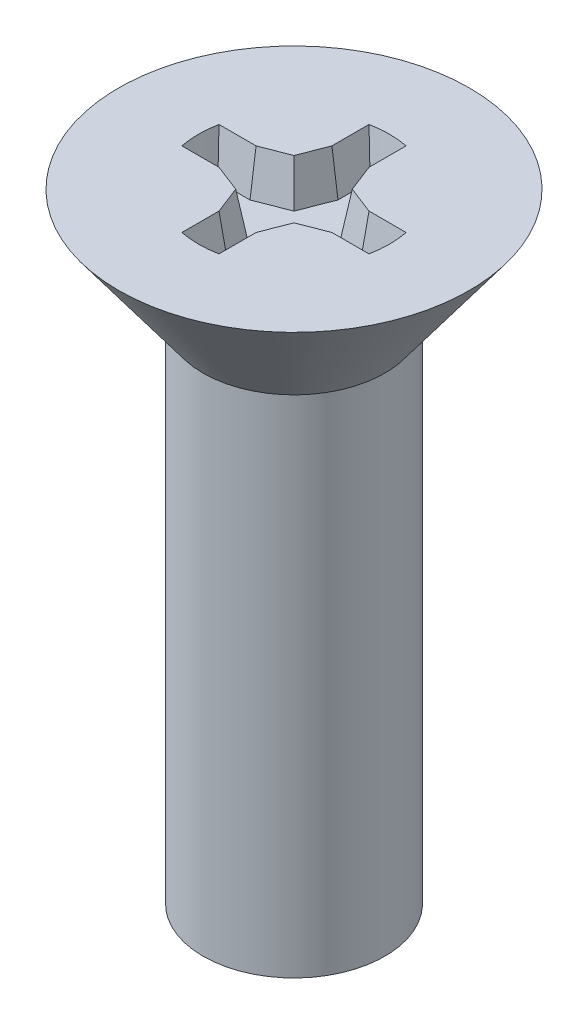
ISO-10303-21;
HEADER;
FILE_DESCRIPTION(('STEP AP214'),'2;1');
FILE_NAME('part.step','',(''),(''),'','','');
FILE_SCHEMA(('AUTOMOTIVE_DESIGN { 1 0 10303 214 1 1 1 1 }'));
ENDSEC;
DATA;
#1=APPLICATION_CONTEXT('core data for automotive mechanical design processes');
#2=APPLICATION_PROTOCOL_DEFINITION('international standard','automotive_design',2000,#1);
#3=PRODUCT_CONTEXT('',#1,'mechanical');
#4=PRODUCT('Part','Part','',(#3));
#5=PRODUCT_RELATED_PRODUCT_CATEGORY('part','',(#4));
#6=PRODUCT_DEFINITION_FORMATION('','',#4);
#7=PRODUCT_DEFINITION_CONTEXT('part definition',#1,'design');
#8=PRODUCT_DEFINITION('design','',#6,#7);
#9=PRODUCT_DEFINITION_SHAPE('','',#8);
#10=(LENGTH_UNIT() NAMED_UNIT(*) SI_UNIT(.MILLI.,.METRE.));
#11=(NAMED_UNIT(*) PLANE_ANGLE_UNIT() SI_UNIT($,.RADIAN.));
#12=(NAMED_UNIT(*) SI_UNIT($,.STERADIAN.) SOLID_ANGLE_UNIT());
#13=UNCERTAINTY_MEASURE_WITH_UNIT(LENGTH_MEASURE(1.E-05),#10,'distance_accuracy_value','');
#14=(GEOMETRIC_REPRESENTATION_CONTEXT(3) GLOBAL_UNCERTAINTY_ASSIGNED_CONTEXT((#13)) GLOBAL_UNIT_ASSIGNED_CONTEXT((#10,
#11,#12)) REPRESENTATION_CONTEXT('',''));
#15=CARTESIAN_POINT('',(0.,0.,0.));
#16=DIRECTION('',(0.,0.,1.));
#17=DIRECTION('',(1.,0.,0.));
#18=AXIS2_PLACEMENT_3D('',#15,#16,#17);
#19=CARTESIAN_POINT('',(-0.925519669670004,1.35,0.));
#20=DIRECTION('',(0.,-1.,0.));
#21=DIRECTION('',(0.,0.,-1.));
#22=AXIS2_PLACEMENT_3D('',#19,#20,#21);
#23=PLANE('',#22);
#24=DIRECTION('',(0.361616294640555,0.,0.932327011005492));
#25=VECTOR('',#24,1.);
#26=CARTESIAN_POINT('',(-0.218484474493163,1.35,1.0146341907738));
#27=LINE('',#26,#25);
#28=CARTESIAN_POINT('',(-0.440983179903434,1.35,0.440983179903433));
#29=VERTEX_POINT('',#28);
#30=CARTESIAN_POINT('',(-0.208938415433229,1.35,1.03924604826511));
#31=VERTEX_POINT('',#30);
#32=EDGE_CURVE('E124',#29,#31,#27,.T.);
#33=ORIENTED_EDGE('',*,*,#32,.T.);
#34=DIRECTION('',(0.,0.,1.));
#35=VECTOR('',#34,1.);
#36=CARTESIAN_POINT('',(-0.208938415433228,1.35,1.76564435830096));
#37=LINE('',#36,#35);
#38=CARTESIAN_POINT('',(-0.208938415433889,1.35000000000109,1.64572822932288));
#39=VERTEX_POINT('',#38);
#40=EDGE_CURVE('E127',#31,#39,#37,.T.);
#41=ORIENTED_EDGE('',*,*,#40,.T.);
#42=CARTESIAN_POINT('',(0.,1.35000000000218,0.));
#43=DIRECTION('',(0.,1.,0.));
#44=DIRECTION('',(0.,0.,1.));
#45=AXIS2_PLACEMENT_3D('',#42,#43,#44);
#46=CIRCLE('',#45,1.65893841544371);
#47=CARTESIAN_POINT('',(0.208938415433228,1.35000000000109,1.64572822931788));
#48=VERTEX_POINT('',#47);
#49=EDGE_CURVE('E170',#39,#48,#46,.T.);
#50=ORIENTED_EDGE('',*,*,#49,.T.);
#51=DIRECTION('',(0.,0.,1.));
#52=VECTOR('',#51,1.);
#53=CARTESIAN_POINT('',(0.208938415433228,1.35,1.06564435830096));
#54=LINE('',#53,#52);
#55=CARTESIAN_POINT('',(0.208938415433228,1.35,1.03924604826511));
#56=VERTEX_POINT('',#55);
#57=EDGE_CURVE('E171',#48,#56,#54,.F.);
#58=ORIENTED_EDGE('',*,*,#57,.T.);
#59=DIRECTION('',(0.361616294640553,0.,-0.932327011005493));
#60=VECTOR('',#59,1.);
#61=CARTESIAN_POINT('',(0.418484474493161,1.35,0.49898983247284));
#62=LINE('',#61,#60);
#63=CARTESIAN_POINT('',(0.440983179903431,1.35,0.440983179903435));
#64=VERTEX_POINT('',#63);
#65=EDGE_CURVE('E396',#56,#64,#62,.T.);
#66=ORIENTED_EDGE('',*,*,#65,.T.);
#67=DIRECTION('',(0.932327011005492,0.,-0.361616294640556));
#68=VECTOR('',#67,1.);
#69=CARTESIAN_POINT('',(1.0146341907738,1.35,0.218484474493163));
#70=LINE('',#69,#68);
#71=CARTESIAN_POINT('',(1.03924604826511,1.35,0.208938415433229));
#72=VERTEX_POINT('',#71);
#73=EDGE_CURVE('E213',#64,#72,#70,.T.);
#74=ORIENTED_EDGE('',*,*,#73,.T.);
#75=DIRECTION('',(1.,0.,0.));
#76=VECTOR('',#75,1.);
#77=CARTESIAN_POINT('',(1.76564435830096,1.35,0.208938415433228));
#78=LINE('',#77,#76);
#79=CARTESIAN_POINT('',(1.64572822930434,1.35000000000109,0.208938415432721));
#80=VERTEX_POINT('',#79);
#81=EDGE_CURVE('E214',#72,#80,#78,.T.);
#82=ORIENTED_EDGE('',*,*,#81,.T.);
#83=CARTESIAN_POINT('',(0.,1.35000000000218,0.));
#84=DIRECTION('',(0.,1.,0.));
#85=DIRECTION('',(0.,0.,1.));
#86=AXIS2_PLACEMENT_3D('',#83,#84,#85);
#87=CIRCLE('',#86,1.65893841542517);
#88=CARTESIAN_POINT('',(1.6457282293085,1.35000000000109,-0.20893841543342));
#89=VERTEX_POINT('',#88);
#90=EDGE_CURVE('E434',#80,#89,#87,.T.);
#91=ORIENTED_EDGE('',*,*,#90,.T.);
#92=DIRECTION('',(1.,0.,0.));
#93=VECTOR('',#92,1.);
#94=CARTESIAN_POINT('',(1.06564435830096,1.35,-0.208938415433227));
#95=LINE('',#94,#93);
#96=CARTESIAN_POINT('',(1.03924604826511,1.35,-0.208938415433228));
#97=VERTEX_POINT('',#96);
#98=EDGE_CURVE('E435',#89,#97,#95,.F.);
#99=ORIENTED_EDGE('',*,*,#98,.T.);
#100=DIRECTION('',(-0.932327011005493,0.,-0.361616294640552));
#101=VECTOR('',#100,1.);
#102=CARTESIAN_POINT('',(0.498989832472839,1.35,-0.418484474493161));
#103=LINE('',#102,#101);
#104=CARTESIAN_POINT('',(0.440983179903434,1.35,-0.440983179903431));
#105=VERTEX_POINT('',#104);
#106=EDGE_CURVE('E217',#97,#105,#103,.T.);
#107=ORIENTED_EDGE('',*,*,#106,.T.);
#108=DIRECTION('',(-0.361616294640555,0.,-0.932327011005492));
#109=VECTOR('',#108,1.);
#110=CARTESIAN_POINT('',(0.218484474493163,1.35,-1.0146341907738));
#111=LINE('',#110,#109);
#112=CARTESIAN_POINT('',(0.208938415433229,1.35,-1.03924604826511));
#113=VERTEX_POINT('',#112);
#114=EDGE_CURVE('E230',#105,#113,#111,.T.);
#115=ORIENTED_EDGE('',*,*,#114,.T.);
#116=DIRECTION('',(0.,0.,1.));
#117=VECTOR('',#116,1.);
#118=CARTESIAN_POINT('',(0.208938415433228,1.35,-1.76564435830096));
#119=LINE('',#118,#117);
#120=CARTESIAN_POINT('',(0.208938415433258,1.35000000000109,-1.64572822931286));
#121=VERTEX_POINT('',#120);
#122=EDGE_CURVE('E241',#113,#121,#119,.F.);
#123=ORIENTED_EDGE('',*,*,#122,.T.);
#124=CARTESIAN_POINT('',(0.,1.35000000000218,0.));
#125=DIRECTION('',(0.,1.,0.));
#126=DIRECTION('',(0.,0.,1.));
#127=AXIS2_PLACEMENT_3D('',#124,#125,#126);
#128=CIRCLE('',#127,1.65893841543369);
#129=CARTESIAN_POINT('',(-0.208938415433421,1.35000000000109,-1.6457282293128));
#130=VERTEX_POINT('',#129);
#131=EDGE_CURVE('E270',#121,#130,#128,.T.);
#132=ORIENTED_EDGE('',*,*,#131,.T.);
#133=DIRECTION('',(0.,0.,1.));
#134=VECTOR('',#133,1.);
#135=CARTESIAN_POINT('',(-0.208938415433228,1.35,-1.06564435830096));
#136=LINE('',#135,#134);
#137=CARTESIAN_POINT('',(-0.208938415433229,1.35,-1.03924604826511));
#138=VERTEX_POINT('',#137);
#139=EDGE_CURVE('E273',#130,#138,#136,.T.);
#140=ORIENTED_EDGE('',*,*,#139,.T.);
#141=DIRECTION('',(-0.361616294640553,0.,0.932327011005493));
#142=VECTOR('',#141,1.);
#143=CARTESIAN_POINT('',(-0.418484474493163,1.35,-0.498989832472838));
#144=LINE('',#143,#142);
#145=CARTESIAN_POINT('',(-0.440983179903433,1.35,-0.440983179903434));
#146=VERTEX_POINT('',#145);
#147=EDGE_CURVE('E242',#138,#146,#144,.T.);
#148=ORIENTED_EDGE('',*,*,#147,.T.);
#149=DIRECTION('',(-0.932327011005492,0.,0.361616294640555));
#150=VECTOR('',#149,1.);
#151=CARTESIAN_POINT('',(-1.0146341907738,1.35,-0.218484474493162));
#152=LINE('',#151,#150);
#153=CARTESIAN_POINT('',(-1.03924604826511,1.35,-0.208938415433228));
#154=VERTEX_POINT('',#153);
#155=EDGE_CURVE('E314',#146,#154,#152,.T.);
#156=ORIENTED_EDGE('',*,*,#155,.T.);
#157=DIRECTION('',(1.,0.,0.));
#158=VECTOR('',#157,1.);
#159=CARTESIAN_POINT('',(-1.76564435830096,1.35,-0.208938415433227));
#160=LINE('',#159,#158);
#161=CARTESIAN_POINT('',(-1.64572822930364,1.35000000000109,-0.208938415432676));
#162=VERTEX_POINT('',#161);
#163=EDGE_CURVE('E108',#154,#162,#160,.F.);
#164=ORIENTED_EDGE('',*,*,#163,.T.);
#165=CARTESIAN_POINT('',(0.,1.35000000000218,0.));
#166=DIRECTION('',(0.,1.,0.));
#167=DIRECTION('',(0.,0.,1.));
#168=AXIS2_PLACEMENT_3D('',#165,#166,#167);
#169=CIRCLE('',#168,1.65893841542447);
#170=CARTESIAN_POINT('',(-1.64572822930815,1.35000000000109,0.208938415433421));
#171=VERTEX_POINT('',#170);
#172=EDGE_CURVE('E28',#162,#171,#169,.T.);
#173=ORIENTED_EDGE('',*,*,#172,.T.);
#174=DIRECTION('',(1.,0.,0.));
#175=VECTOR('',#174,1.);
#176=CARTESIAN_POINT('',(-1.06564435830096,1.35,0.208938415433228));
#177=LINE('',#176,#175);
#178=CARTESIAN_POINT('',(-1.03924604826511,1.35,0.208938415433229));
#179=VERTEX_POINT('',#178);
#180=EDGE_CURVE('E117',#171,#179,#177,.T.);
#181=ORIENTED_EDGE('',*,*,#180,.T.);
#182=DIRECTION('',(0.932327011005493,0.,0.361616294640553));
#183=VECTOR('',#182,1.);
#184=CARTESIAN_POINT('',(-0.498989832472839,1.35,0.418484474493163));
#185=LINE('',#184,#183);
#186=EDGE_CURVE('E128',#179,#29,#185,.T.);
#187=ORIENTED_EDGE('',*,*,#186,.T.);
#188=EDGE_LOOP('',(#33,#41,#50,#58,#66,#74,#82,#91,#99,#107,#115,#123,#132,#140,#148,#156,#164,
#173,#181,#187));
#189=FACE_BOUND('',#188,.T.);
#190=ADVANCED_FACE('F25',(#189),#23,.F.);
#191=CARTESIAN_POINT('',(-0.35,2.15,1.06564435830096));
#192=DIRECTION('',(-0.918162868780907,-0.17364817766693,0.356122530577566));
#193=DIRECTION('',(0.361616294640555,0.,0.932327011005492));
#194=AXIS2_PLACEMENT_3D('',#191,#192,#193);
#195=PLANE('',#194);
#196=DIRECTION('',(0.173556561603969,-0.98428817249995,-0.0324794304278424));
#197=VECTOR('',#196,1.);
#198=CARTESIAN_POINT('',(-0.35,2.15,1.06564435830096));
#199=LINE('',#198,#197);
#200=CARTESIAN_POINT('',(-0.35,2.15,1.06564435830096));
#201=VERTEX_POINT('',#200);
#202=EDGE_CURVE('E136',#201,#31,#199,.T.);
#203=ORIENTED_EDGE('',*,*,#202,.T.);
#204=ORIENTED_EDGE('',*,*,#32,.F.);
#205=DIRECTION('',(-0.133808874519465,0.98193195802951,0.133808874519467));
#206=VECTOR('',#205,1.);
#207=CARTESIAN_POINT('',(-0.440983179903434,1.35,0.440983179903433));
#208=LINE('',#207,#206);
#209=CARTESIAN_POINT('',(-0.55,2.15,0.55));
#210=VERTEX_POINT('',#209);
#211=EDGE_CURVE('E557',#29,#210,#208,.T.);
#212=ORIENTED_EDGE('',*,*,#211,.T.);
#213=DIRECTION('',(-0.361616294640553,0.,-0.932327011005493));
#214=VECTOR('',#213,1.);
#215=CARTESIAN_POINT('',(-0.35,2.15,1.06564435830096));
#216=LINE('',#215,#214);
#217=EDGE_CURVE('E139',#201,#210,#216,.T.);
#218=ORIENTED_EDGE('',*,*,#217,.F.);
#219=EDGE_LOOP('',(#203,#204,#212,#218));
#220=FACE_BOUND('',#219,.T.);
#221=ADVANCED_FACE('F137',(#220),#195,.F.);
#222=CARTESIAN_POINT('',(-0.55,2.15,0.55));
#223=DIRECTION('',(-0.356122530577564,-0.173648177666931,0.918162868780908));
#224=DIRECTION('',(0.932327011005493,0.,0.361616294640553));
#225=AXIS2_PLACEMENT_3D('',#222,#223,#224);
#226=PLANE('',#225);
#227=ORIENTED_EDGE('',*,*,#211,.F.);
#228=ORIENTED_EDGE('',*,*,#186,.F.);
#229=DIRECTION('',(-0.0324794304278424,0.98428817249995,0.17355656160397));
#230=VECTOR('',#229,1.);
#231=CARTESIAN_POINT('',(-1.03924604826511,1.35,0.208938415433228));
#232=LINE('',#231,#230);
#233=CARTESIAN_POINT('',(-1.06564435830096,2.15,0.350000000000001));
#234=VERTEX_POINT('',#233);
#235=EDGE_CURVE('E643',#179,#234,#232,.T.);
#236=ORIENTED_EDGE('',*,*,#235,.T.);
#237=DIRECTION('',(-0.932327011005494,0.,-0.361616294640551));
#238=VECTOR('',#237,1.);
#239=CARTESIAN_POINT('',(-0.55,2.15,0.55));
#240=LINE('',#239,#238);
#241=EDGE_CURVE('E163',#210,#234,#240,.T.);
#242=ORIENTED_EDGE('',*,*,#241,.F.);
#243=EDGE_LOOP('',(#227,#228,#236,#242));
#244=FACE_BOUND('',#243,.T.);
#245=ADVANCED_FACE('F339',(#244),#226,.F.);
#246=CARTESIAN_POINT('',(-1.06564435830096,2.15,0.350000000000001));
#247=DIRECTION('',(0.,-0.173648177666931,0.984807753012208));
#248=DIRECTION('',(0.,-0.984807753012208,-0.173648177666931));
#249=AXIS2_PLACEMENT_3D('',#246,#247,#248);
#250=PLANE('',#249);
#251=ORIENTED_EDGE('',*,*,#235,.F.);
#252=ORIENTED_EDGE('',*,*,#180,.F.);
#253=CARTESIAN_POINT('',(-1.76564435830096,2.15,0.350000000000001));
#254=CARTESIAN_POINT('',(-1.7056862937075,1.73593925162568,0.276989918409269));
#255=CARTESIAN_POINT('',(-1.64572822931259,1.35,0.208938415433228));
#256=B_SPLINE_CURVE_WITH_KNOTS('',2,(#253,#254,#255),.UNSPECIFIED.,.F.,.F.,(3,3),(0.,1.),.UNSPECIFIED.);
#257=CARTESIAN_POINT('',(-1.76564435830135,2.15000000001437,0.350000000000001));
#258=VERTEX_POINT('',#257);
#259=EDGE_CURVE('E320',#171,#258,#256,.F.);
#260=ORIENTED_EDGE('',*,*,#259,.T.);
#261=DIRECTION('',(1.,0.,0.));
#262=VECTOR('',#261,1.);
#263=CARTESIAN_POINT('',(0.,2.15,0.350000000000001));
#264=LINE('',#263,#262);
#265=EDGE_CURVE('E509',#234,#258,#264,.F.);
#266=ORIENTED_EDGE('',*,*,#265,.F.);
#267=EDGE_LOOP('',(#251,#252,#260,#266));
#268=FACE_BOUND('',#267,.T.);
#269=ADVANCED_FACE('F328',(#268),#250,.F.);
#270=CARTESIAN_POINT('',(0.,2.14999999985821,0.));
#271=DIRECTION('',(0.,1.,0.));
#272=DIRECTION('',(0.,0.,1.));
#273=AXIS2_PLACEMENT_3D('',#270,#271,#272);
#274=CONICAL_SURFACE('',#273,1.79999999997071,0.174532925205307);
#275=ORIENTED_EDGE('',*,*,#259,.F.);
#276=ORIENTED_EDGE('',*,*,#172,.F.);
#277=CARTESIAN_POINT('',(-1.6457282293038,1.35000000000156,-0.208938415432112));
#278=CARTESIAN_POINT('',(-1.65070934139582,1.3820625774919,-0.214591907998902));
#279=CARTESIAN_POINT('',(-1.65566838188282,1.41412848763102,-0.220245937330613));
#280=CARTESIAN_POINT('',(-1.66559816802352,1.47862236928866,-0.231617794663121));
#281=CARTESIAN_POINT('',(-1.6705684336483,1.51105041256893,-0.237335634852783));
#282=CARTESIAN_POINT('',(-1.6805203681666,1.57626855896286,-0.248835174664004));
#283=CARTESIAN_POINT('',(-1.68550156418484,1.60905873201504,-0.254616886832574));
#284=CARTESIAN_POINT('',(-1.69547505663126,1.67500114064804,-0.266244202269753));
#285=CARTESIAN_POINT('',(-1.70046688710381,1.70815344447968,-0.27208981812157));
#286=CARTESIAN_POINT('',(-1.71046136137333,1.77482011604494,-0.283844952154033));
#287=CARTESIAN_POINT('',(-1.71546354608948,1.8083345504105,-0.289754482738613));
#288=CARTESIAN_POINT('',(-1.72547845290019,1.87572548488629,-0.301637434665236));
#289=CARTESIAN_POINT('',(-1.73049072269614,1.90960205009352,-0.307610868000329));
#290=CARTESIAN_POINT('',(-1.74052554004884,1.97771724705958,-0.319621593283294));
#291=CARTESIAN_POINT('',(-1.74554764205458,2.01195594244403,-0.325658896614664));
#292=CARTESIAN_POINT('',(-1.75560186777891,2.08079540382918,-0.337797304175388));
#293=CARTESIAN_POINT('',(-1.76063355252783,2.11539623208874,-0.343898418936132));
#294=CARTESIAN_POINT('',(-1.76564435829687,2.15000000000073,-0.34999999999919));
#295=B_SPLINE_CURVE_WITH_KNOTS('',3,(#277,#278,#279,#280,#281,#282,#283,#284,#285,#286,#287,
#288,#289,#290,#291,#292,#293,#294),.UNSPECIFIED.,.F.,.F.,(4,2,2,2,2,2,2,2,4),(0.,
0.0988080918933877,0.198711901448957,0.299711495062222,0.401806930357422,0.504998256525959,
0.609285514650121,0.714668738013174,0.821147952396807),.UNSPECIFIED.);
#296=CARTESIAN_POINT('',(-1.76564435829931,2.15000000001474,-0.349999999999594));
#297=VERTEX_POINT('',#296);
#298=EDGE_CURVE('E319',#162,#297,#295,.T.);
#299=ORIENTED_EDGE('',*,*,#298,.T.);
#300=CARTESIAN_POINT('',(0.,2.15000000002874,0.));
#301=DIRECTION('',(0.,1.,0.));
#302=DIRECTION('',(0.,0.,1.));
#303=AXIS2_PLACEMENT_3D('',#300,#301,#302);
#304=CIRCLE('',#303,1.80000000000077);
#305=EDGE_CURVE('E505',#258,#297,#304,.F.);
#306=ORIENTED_EDGE('',*,*,#305,.F.);
#307=EDGE_LOOP('',(#275,#276,#299,#306));
#308=FACE_BOUND('',#307,.T.);
#309=ADVANCED_FACE('F338',(#308),#274,.F.);
#310=CARTESIAN_POINT('',(-1.76564435830096,2.15,-0.349999999999999));
#311=DIRECTION('',(0.,-0.17364817766693,-0.984807753012208));
#312=DIRECTION('',(0.,0.984807753012208,-0.17364817766693));
#313=AXIS2_PLACEMENT_3D('',#310,#311,#312);
#314=PLANE('',#313);
#315=ORIENTED_EDGE('',*,*,#298,.F.);
#316=ORIENTED_EDGE('',*,*,#163,.F.);
#317=DIRECTION('',(-0.0324794304278416,0.98428817249995,-0.173556561603967));
#318=VECTOR('',#317,1.);
#319=CARTESIAN_POINT('',(-1.03924604826511,1.35,-0.208938415433229));
#320=LINE('',#319,#318);
#321=CARTESIAN_POINT('',(-1.06564435830096,2.15,-0.349999999999999));
#322=VERTEX_POINT('',#321);
#323=EDGE_CURVE('E310',#154,#322,#320,.T.);
#324=ORIENTED_EDGE('',*,*,#323,.T.);
#325=DIRECTION('',(1.,0.,0.));
#326=VECTOR('',#325,1.);
#327=CARTESIAN_POINT('',(0.,2.15,-0.349999999999999));
#328=LINE('',#327,#326);
#329=EDGE_CURVE('E307',#297,#322,#328,.T.);
#330=ORIENTED_EDGE('',*,*,#329,.F.);
#331=EDGE_LOOP('',(#315,#316,#324,#330));
#332=FACE_BOUND('',#331,.T.);
#333=ADVANCED_FACE('F689',(#332),#314,.F.);
#334=CARTESIAN_POINT('',(-1.06564435830096,2.15,-0.349999999999999));
#335=DIRECTION('',(-0.356122530577566,-0.17364817766693,-0.918162868780907));
#336=DIRECTION('',(-0.932327011005492,0.,0.361616294640555));
#337=AXIS2_PLACEMENT_3D('',#334,#335,#336);
#338=PLANE('',#337);
#339=ORIENTED_EDGE('',*,*,#323,.F.);
#340=ORIENTED_EDGE('',*,*,#155,.F.);
#341=DIRECTION('',(-0.133808874519466,0.98193195802951,-0.133808874519465));
#342=VECTOR('',#341,1.);
#343=CARTESIAN_POINT('',(-0.440983179903433,1.35,-0.440983179903434));
#344=LINE('',#343,#342);
#345=CARTESIAN_POINT('',(-0.55,2.15,-0.55));
#346=VERTEX_POINT('',#345);
#347=EDGE_CURVE('E283',#146,#346,#344,.T.);
#348=ORIENTED_EDGE('',*,*,#347,.T.);
#349=DIRECTION('',(0.932327011005493,0.,-0.361616294640554));
#350=VECTOR('',#349,1.);
#351=CARTESIAN_POINT('',(-1.06564435830096,2.15,-0.349999999999999));
#352=LINE('',#351,#350);
#353=EDGE_CURVE('E296',#322,#346,#352,.T.);
#354=ORIENTED_EDGE('',*,*,#353,.F.);
#355=EDGE_LOOP('',(#339,#340,#348,#354));
#356=FACE_BOUND('',#355,.T.);
#357=ADVANCED_FACE('F632',(#356),#338,.F.);
#358=CARTESIAN_POINT('',(-0.55,2.15,-0.549999999999999));
#359=DIRECTION('',(-0.918162868780908,-0.17364817766693,-0.356122530577564));
#360=DIRECTION('',(-0.361616294640553,0.,0.932327011005493));
#361=AXIS2_PLACEMENT_3D('',#358,#359,#360);
#362=PLANE('',#361);
#363=ORIENTED_EDGE('',*,*,#347,.F.);
#364=ORIENTED_EDGE('',*,*,#147,.F.);
#365=DIRECTION('',(-0.173556561603969,0.98428817249995,-0.0324794304278424));
#366=VECTOR('',#365,1.);
#367=CARTESIAN_POINT('',(-0.208938415433228,1.35,-1.03924604826511));
#368=LINE('',#367,#366);
#369=CARTESIAN_POINT('',(-0.35,2.15,-1.06564435830096));
#370=VERTEX_POINT('',#369);
#371=EDGE_CURVE('E282',#138,#370,#368,.T.);
#372=ORIENTED_EDGE('',*,*,#371,.T.);
#373=DIRECTION('',(0.361616294640553,0.,-0.932327011005493));
#374=VECTOR('',#373,1.);
#375=CARTESIAN_POINT('',(-0.55,2.15,-0.55));
#376=LINE('',#375,#374);
#377=EDGE_CURVE('E291',#346,#370,#376,.T.);
#378=ORIENTED_EDGE('',*,*,#377,.F.);
#379=EDGE_LOOP('',(#363,#364,#372,#378));
#380=FACE_BOUND('',#379,.T.);
#381=ADVANCED_FACE('F261',(#380),#362,.F.);
#382=CARTESIAN_POINT('',(-0.35,2.15,-1.06564435830096));
#383=DIRECTION('',(-0.984807753012208,-0.17364817766693,0.));
#384=DIRECTION('',(0.17364817766693,-0.984807753012208,0.));
#385=AXIS2_PLACEMENT_3D('',#382,#383,#384);
#386=PLANE('',#385);
#387=ORIENTED_EDGE('',*,*,#371,.F.);
#388=ORIENTED_EDGE('',*,*,#139,.F.);
#389=CARTESIAN_POINT('',(-0.35,2.15,-1.76564435830096));
#390=CARTESIAN_POINT('',(-0.276989918408215,1.7359392516197,-1.7056862938678));
#391=CARTESIAN_POINT('',(-0.208938415433228,1.35,-1.64572822931259));
#392=B_SPLINE_CURVE_WITH_KNOTS('',2,(#389,#390,#391),.UNSPECIFIED.,.F.,.F.,(3,3),(0.,1.),.UNSPECIFIED.);
#393=CARTESIAN_POINT('',(-0.35,2.15000000001437,-1.76564435830094));
#394=VERTEX_POINT('',#393);
#395=EDGE_CURVE('E265',#130,#394,#392,.F.);
#396=ORIENTED_EDGE('',*,*,#395,.T.);
#397=DIRECTION('',(0.,0.,1.));
#398=VECTOR('',#397,1.);
#399=CARTESIAN_POINT('',(-0.35,2.15,-3.31));
#400=LINE('',#399,#398);
#401=EDGE_CURVE('E295',#370,#394,#400,.F.);
#402=ORIENTED_EDGE('',*,*,#401,.F.);
#403=EDGE_LOOP('',(#387,#388,#396,#402));
#404=FACE_BOUND('',#403,.T.);
#405=ADVANCED_FACE('F255',(#404),#386,.F.);
#406=CARTESIAN_POINT('',(0.,2.15000000002874,0.));
#407=DIRECTION('',(0.,1.,0.));
#408=DIRECTION('',(0.,0.,1.));
#409=AXIS2_PLACEMENT_3D('',#406,#407,#408);
#410=CONICAL_SURFACE('',#409,1.79999999999997,0.174532925193156);
#411=ORIENTED_EDGE('',*,*,#395,.F.);
#412=ORIENTED_EDGE('',*,*,#131,.F.);
#413=CARTESIAN_POINT('',(0.208938415433238,1.34999999999999,-1.64572822931266));
#414=CARTESIAN_POINT('',(0.214591908006114,1.38206257751534,-1.65070934140795));
#415=CARTESIAN_POINT('',(0.220245937343788,1.41412848767949,-1.65566838189819));
#416=CARTESIAN_POINT('',(0.231617794686658,1.47862236938007,-1.66559816804421));
#417=CARTESIAN_POINT('',(0.237335634880716,1.51105041267825,-1.67056843367108));
#418=CARTESIAN_POINT('',(0.24883517469909,1.57626855910085,-1.68052036819246));
#419=CARTESIAN_POINT('',(0.254616886870412,1.6090587321638,-1.68550156421169));
#420=CARTESIAN_POINT('',(0.266244202311385,1.67500114081121,-1.69547505665906));
#421=CARTESIAN_POINT('',(0.272089818164238,1.70815344464649,-1.70046688713156));
#422=CARTESIAN_POINT('',(0.28384495219699,1.77482011621188,-1.71046136139999));
#423=CARTESIAN_POINT('',(0.289754482780817,1.80833455057395,-1.7154635461151));
#424=CARTESIAN_POINT('',(0.301637434704071,1.87572548503562,-1.72547845292279));
#425=CARTESIAN_POINT('',(0.307610868036542,1.90960205023222,-1.73049072271678));
#426=CARTESIAN_POINT('',(0.319621593312339,1.97771724716988,-1.74052554006464));
#427=CARTESIAN_POINT('',(0.325658896639152,2.01195594253657,-1.74554764206753));
#428=CARTESIAN_POINT('',(0.337797304188762,2.08079540387906,-1.75560186778533));
#429=CARTESIAN_POINT('',(0.343898418942938,2.11539623211373,-1.76063355253059));
#430=CARTESIAN_POINT('',(0.349999999999037,2.15000000000087,-1.7656443582961));
#431=B_SPLINE_CURVE_WITH_KNOTS('',3,(#413,#414,#415,#416,#417,#418,#419,#420,#421,#422,#423,
#424,#425,#426,#427,#428,#429,#430),.UNSPECIFIED.,.F.,.F.,(4,2,2,2,2,2,2,2,4),(0.,
0.0988080919710462,0.198711901582118,0.299711495228713,0.401806930535056,0.504998256692533,
0.609285514783416,0.714668738090959,0.821147952396834),.UNSPECIFIED.);
#432=CARTESIAN_POINT('',(0.349999999999519,2.15000000001481,-1.76564435829851));
#433=VERTEX_POINT('',#432);
#434=EDGE_CURVE('E234',#121,#433,#431,.T.);
#435=ORIENTED_EDGE('',*,*,#434,.T.);
#436=CARTESIAN_POINT('',(0.,2.15000000002874,0.));
#437=DIRECTION('',(0.,1.,0.));
#438=DIRECTION('',(0.,0.,1.));
#439=AXIS2_PLACEMENT_3D('',#436,#437,#438);
#440=CIRCLE('',#439,1.79999999999997);
#441=EDGE_CURVE('E492',#394,#433,#440,.F.);
#442=ORIENTED_EDGE('',*,*,#441,.F.);
#443=EDGE_LOOP('',(#411,#412,#435,#442));
#444=FACE_BOUND('',#443,.T.);
#445=ADVANCED_FACE('F244',(#444),#410,.F.);
#446=CARTESIAN_POINT('',(0.35,2.15,-1.76564435830096));
#447=DIRECTION('',(0.984807753012208,-0.17364817766693,0.));
#448=DIRECTION('',(0.17364817766693,0.984807753012208,0.));
#449=AXIS2_PLACEMENT_3D('',#446,#447,#448);
#450=PLANE('',#449);
#451=ORIENTED_EDGE('',*,*,#434,.F.);
#452=ORIENTED_EDGE('',*,*,#122,.F.);
#453=DIRECTION('',(0.173556561603967,0.98428817249995,-0.0324794304278416));
#454=VECTOR('',#453,1.);
#455=CARTESIAN_POINT('',(0.20893841543323,1.35,-1.03924604826511));
#456=LINE('',#455,#454);
#457=CARTESIAN_POINT('',(0.35,2.15,-1.06564435830096));
#458=VERTEX_POINT('',#457);
#459=EDGE_CURVE('E227',#113,#458,#456,.T.);
#460=ORIENTED_EDGE('',*,*,#459,.T.);
#461=DIRECTION('',(0.,0.,1.));
#462=VECTOR('',#461,1.);
#463=CARTESIAN_POINT('',(0.35,2.15,-3.31));
#464=LINE('',#463,#462);
#465=EDGE_CURVE('E467',#433,#458,#464,.T.);
#466=ORIENTED_EDGE('',*,*,#465,.F.);
#467=EDGE_LOOP('',(#451,#452,#460,#466));
#468=FACE_BOUND('',#467,.T.);
#469=ADVANCED_FACE('F254',(#468),#450,.F.);
#470=CARTESIAN_POINT('',(0.35,2.15,-1.06564435830096));
#471=DIRECTION('',(0.918162868780907,-0.17364817766693,-0.356122530577566));
#472=DIRECTION('',(-0.361616294640555,0.,-0.932327011005492));
#473=AXIS2_PLACEMENT_3D('',#470,#471,#472);
#474=PLANE('',#473);
#475=ORIENTED_EDGE('',*,*,#459,.F.);
#476=ORIENTED_EDGE('',*,*,#114,.F.);
#477=DIRECTION('',(0.133808874519466,0.98193195802951,-0.133808874519466));
#478=VECTOR('',#477,1.);
#479=CARTESIAN_POINT('',(0.440983179903434,1.35,-0.440983179903431));
#480=LINE('',#479,#478);
#481=CARTESIAN_POINT('',(0.550000000000001,2.15,-0.549999999999998));
#482=VERTEX_POINT('',#481);
#483=EDGE_CURVE('E226',#105,#482,#480,.T.);
#484=ORIENTED_EDGE('',*,*,#483,.T.);
#485=DIRECTION('',(0.361616294640554,0.,0.932327011005493));
#486=VECTOR('',#485,1.);
#487=CARTESIAN_POINT('',(0.35,2.15,-1.06564435830096));
#488=LINE('',#487,#486);
#489=EDGE_CURVE('E457',#458,#482,#488,.T.);
#490=ORIENTED_EDGE('',*,*,#489,.F.);
#491=EDGE_LOOP('',(#475,#476,#484,#490));
#492=FACE_BOUND('',#491,.T.);
#493=ADVANCED_FACE('F660',(#492),#474,.F.);
#494=CARTESIAN_POINT('',(0.55,2.15,-0.549999999999998));
#495=DIRECTION('',(0.356122530577563,-0.17364817766693,-0.918162868780908));
#496=DIRECTION('',(-0.932327011005493,0.,-0.361616294640552));
#497=AXIS2_PLACEMENT_3D('',#494,#495,#496);
#498=PLANE('',#497);
#499=ORIENTED_EDGE('',*,*,#483,.F.);
#500=ORIENTED_EDGE('',*,*,#106,.F.);
#501=DIRECTION('',(0.0324794304278424,0.98428817249995,-0.173556561603969));
#502=VECTOR('',#501,1.);
#503=CARTESIAN_POINT('',(1.03924604826511,1.35,-0.208938415433227));
#504=LINE('',#503,#502);
#505=CARTESIAN_POINT('',(1.06564435830096,2.15,-0.349999999999999));
#506=VERTEX_POINT('',#505);
#507=EDGE_CURVE('E444',#97,#506,#504,.T.);
#508=ORIENTED_EDGE('',*,*,#507,.T.);
#509=DIRECTION('',(0.932327011005493,0.,0.361616294640553));
#510=VECTOR('',#509,1.);
#511=CARTESIAN_POINT('',(0.550000000000001,2.15,-0.549999999999999));
#512=LINE('',#511,#510);
#513=EDGE_CURVE('E452',#482,#506,#512,.T.);
#514=ORIENTED_EDGE('',*,*,#513,.F.);
#515=EDGE_LOOP('',(#499,#500,#508,#514));
#516=FACE_BOUND('',#515,.T.);
#517=ADVANCED_FACE('F661',(#516),#498,.F.);
#518=CARTESIAN_POINT('',(1.06564435830096,2.15,-0.349999999999999));
#519=DIRECTION('',(0.,-0.17364817766693,-0.984807753012208));
#520=DIRECTION('',(0.,0.984807753012208,-0.17364817766693));
#521=AXIS2_PLACEMENT_3D('',#518,#519,#520);
#522=PLANE('',#521);
#523=ORIENTED_EDGE('',*,*,#507,.F.);
#524=ORIENTED_EDGE('',*,*,#98,.F.);
#525=CARTESIAN_POINT('',(1.76564435830096,2.15,-0.349999999999999));
#526=CARTESIAN_POINT('',(1.70568629361076,1.73593925162664,-0.276989918409438));
#527=CARTESIAN_POINT('',(1.64572822931259,1.35,-0.208938415433227));
#528=B_SPLINE_CURVE_WITH_KNOTS('',2,(#525,#526,#527),.UNSPECIFIED.,.F.,.F.,(3,3),(0.,1.),.UNSPECIFIED.);
#529=CARTESIAN_POINT('',(1.76564435830405,2.15000000001437,-0.349999999999999));
#530=VERTEX_POINT('',#529);
#531=EDGE_CURVE('E428',#89,#530,#528,.F.);
#532=ORIENTED_EDGE('',*,*,#531,.T.);
#533=DIRECTION('',(1.,0.,0.));
#534=VECTOR('',#533,1.);
#535=CARTESIAN_POINT('',(0.,2.15,-0.349999999999999));
#536=LINE('',#535,#534);
#537=EDGE_CURVE('E456',#506,#530,#536,.T.);
#538=ORIENTED_EDGE('',*,*,#537,.F.);
#539=EDGE_LOOP('',(#523,#524,#532,#538));
#540=FACE_BOUND('',#539,.T.);
#541=ADVANCED_FACE('F203',(#540),#522,.F.);
#542=CARTESIAN_POINT('',(0.,2.14999999991505,0.));
#543=DIRECTION('',(0.,1.,0.));
#544=DIRECTION('',(0.,0.,1.));
#545=AXIS2_PLACEMENT_3D('',#542,#543,#544);
#546=CONICAL_SURFACE('',#545,1.79999999998603,0.174532925210893);
#547=ORIENTED_EDGE('',*,*,#531,.F.);
#548=ORIENTED_EDGE('',*,*,#90,.F.);
#549=CARTESIAN_POINT('',(1.64572822930447,1.35000000000144,0.208938415432197));
#550=CARTESIAN_POINT('',(1.65070934140136,1.38206257752389,0.214591908006963));
#551=CARTESIAN_POINT('',(1.6556683818932,1.41412848769513,0.220245937346487));
#552=CARTESIAN_POINT('',(1.66559816804211,1.47862236940785,0.231617794692599));
#553=CARTESIAN_POINT('',(1.67056843367025,1.51105041271107,0.237335634888049));
#554=CARTESIAN_POINT('',(1.68052036819388,1.57626855914169,0.24883517470873));
#555=CARTESIAN_POINT('',(1.68550156421409,1.60905873220762,0.254616886880965));
#556=CARTESIAN_POINT('',(1.6954750566631,1.67500114085894,0.266244202323264));
#557=CARTESIAN_POINT('',(1.70046688713628,1.70815344469515,0.272089818176527));
#558=CARTESIAN_POINT('',(1.71046136140579,1.77482011626033,0.283844952209579));
#559=CARTESIAN_POINT('',(1.71546354612131,1.80833455062127,0.289754482793293));
#560=CARTESIAN_POINT('',(1.72547845292955,1.87572548507861,0.301637434715778));
#561=CARTESIAN_POINT('',(1.73049072272368,1.90960205027201,0.30761086804759));
#562=CARTESIAN_POINT('',(1.74052554007158,1.97771724720124,0.319621593321503));
#563=CARTESIAN_POINT('',(1.74554764207437,2.01195594256268,0.32565889664709));
#564=CARTESIAN_POINT('',(1.75560186779175,2.08079540389262,0.33779730419366));
#565=CARTESIAN_POINT('',(1.76063355253668,2.11539623211997,0.343898418946022));
#566=CARTESIAN_POINT('',(1.76564435830191,2.14999999999983,0.35000000000019));
#567=B_SPLINE_CURVE_WITH_KNOTS('',3,(#549,#550,#551,#552,#553,#554,#555,#556,#557,#558,#559,
#560,#561,#562,#563,#564,#565,#566),.UNSPECIFIED.,.F.,.F.,(4,2,2,2,2,2,2,2,4),(0.,
0.0988080919934527,0.198711901620538,0.299711495276748,0.401806930586304,0.504998256740585,
0.609285514821861,0.714668738113382,0.821147952396814),.UNSPECIFIED.);
#568=CARTESIAN_POINT('',(1.76564435830453,2.15000000001428,0.350000000000095));
#569=VERTEX_POINT('',#568);
#570=EDGE_CURVE('E208',#80,#569,#567,.T.);
#571=ORIENTED_EDGE('',*,*,#570,.T.);
#572=CARTESIAN_POINT('',(0.,2.15000000002874,0.));
#573=DIRECTION('',(0.,1.,0.));
#574=DIRECTION('',(0.,0.,1.));
#575=AXIS2_PLACEMENT_3D('',#572,#573,#574);
#576=CIRCLE('',#575,1.80000000000607);
#577=EDGE_CURVE('E503',#530,#569,#576,.F.);
#578=ORIENTED_EDGE('',*,*,#577,.F.);
#579=EDGE_LOOP('',(#547,#548,#571,#578));
#580=FACE_BOUND('',#579,.T.);
#581=ADVANCED_FACE('F198',(#580),#546,.F.);
#582=CARTESIAN_POINT('',(1.76564435830096,2.15,0.350000000000001));
#583=DIRECTION('',(0.,-0.173648177666931,0.984807753012208));
#584=DIRECTION('',(0.,-0.984807753012208,-0.173648177666931));
#585=AXIS2_PLACEMENT_3D('',#582,#583,#584);
#586=PLANE('',#585);
#587=ORIENTED_EDGE('',*,*,#570,.F.);
#588=ORIENTED_EDGE('',*,*,#81,.F.);
#589=DIRECTION('',(0.0324794304278416,0.98428817249995,0.173556561603968));
#590=VECTOR('',#589,1.);
#591=CARTESIAN_POINT('',(1.03924604826511,1.35,0.20893841543323));
#592=LINE('',#591,#590);
#593=CARTESIAN_POINT('',(1.06564435830096,2.15,0.350000000000001));
#594=VERTEX_POINT('',#593);
#595=EDGE_CURVE('E405',#72,#594,#592,.T.);
#596=ORIENTED_EDGE('',*,*,#595,.T.);
#597=DIRECTION('',(1.,0.,0.));
#598=VECTOR('',#597,1.);
#599=CARTESIAN_POINT('',(0.,2.15,0.350000000000001));
#600=LINE('',#599,#598);
#601=EDGE_CURVE('E418',#569,#594,#600,.F.);
#602=ORIENTED_EDGE('',*,*,#601,.F.);
#603=EDGE_LOOP('',(#587,#588,#596,#602));
#604=FACE_BOUND('',#603,.T.);
#605=ADVANCED_FACE('F194',(#604),#586,.F.);
#606=CARTESIAN_POINT('',(1.06564435830096,2.15,0.350000000000001));
#607=DIRECTION('',(0.356122530577566,-0.173648177666931,0.918162868780907));
#608=DIRECTION('',(0.932327011005492,0.,-0.361616294640556));
#609=AXIS2_PLACEMENT_3D('',#606,#607,#608);
#610=PLANE('',#609);
#611=ORIENTED_EDGE('',*,*,#595,.F.);
#612=ORIENTED_EDGE('',*,*,#73,.F.);
#613=DIRECTION('',(0.133808874519467,0.98193195802951,0.133808874519465));
#614=VECTOR('',#613,1.);
#615=CARTESIAN_POINT('',(0.440983179903431,1.35,0.440983179903435));
#616=LINE('',#615,#614);
#617=CARTESIAN_POINT('',(0.55,2.15,0.550000000000001));
#618=VERTEX_POINT('',#617);
#619=EDGE_CURVE('E390',#64,#618,#616,.T.);
#620=ORIENTED_EDGE('',*,*,#619,.T.);
#621=DIRECTION('',(-0.932327011005493,0.,0.361616294640553));
#622=VECTOR('',#621,1.);
#623=CARTESIAN_POINT('',(1.06564435830096,2.15,0.350000000000001));
#624=LINE('',#623,#622);
#625=EDGE_CURVE('E413',#594,#618,#624,.T.);
#626=ORIENTED_EDGE('',*,*,#625,.F.);
#627=EDGE_LOOP('',(#611,#612,#620,#626));
#628=FACE_BOUND('',#627,.T.);
#629=ADVANCED_FACE('F190',(#628),#610,.F.);
#630=CARTESIAN_POINT('',(0.549999999999999,2.15,0.550000000000001));
#631=DIRECTION('',(0.918162868780908,-0.173648177666931,0.356122530577563));
#632=DIRECTION('',(0.361616294640553,0.,-0.932327011005493));
#633=AXIS2_PLACEMENT_3D('',#630,#631,#632);
#634=PLANE('',#633);
#635=ORIENTED_EDGE('',*,*,#619,.F.);
#636=ORIENTED_EDGE('',*,*,#65,.F.);
#637=DIRECTION('',(0.173556561603969,0.98428817249995,0.0324794304278424));
#638=VECTOR('',#637,1.);
#639=CARTESIAN_POINT('',(0.208938415433228,1.35,1.03924604826511));
#640=LINE('',#639,#638);
#641=CARTESIAN_POINT('',(0.35,2.15,1.06564435830096));
#642=VERTEX_POINT('',#641);
#643=EDGE_CURVE('E386',#56,#642,#640,.T.);
#644=ORIENTED_EDGE('',*,*,#643,.T.);
#645=DIRECTION('',(-0.361616294640553,0.,0.932327011005493));
#646=VECTOR('',#645,1.);
#647=CARTESIAN_POINT('',(0.55,2.15,0.550000000000001));
#648=LINE('',#647,#646);
#649=EDGE_CURVE('E417',#618,#642,#648,.T.);
#650=ORIENTED_EDGE('',*,*,#649,.F.);
#651=EDGE_LOOP('',(#635,#636,#644,#650));
#652=FACE_BOUND('',#651,.T.);
#653=ADVANCED_FACE('F184',(#652),#634,.F.);
#654=CARTESIAN_POINT('',(0.35,2.15,1.06564435830096));
#655=DIRECTION('',(0.984807753012208,-0.17364817766693,0.));
#656=DIRECTION('',(0.17364817766693,0.984807753012208,0.));
#657=AXIS2_PLACEMENT_3D('',#654,#655,#656);
#658=PLANE('',#657);
#659=ORIENTED_EDGE('',*,*,#643,.F.);
#660=ORIENTED_EDGE('',*,*,#57,.F.);
#661=CARTESIAN_POINT('',(0.35,2.15,1.76564435830096));
#662=CARTESIAN_POINT('',(0.276989918407563,1.73593925161601,1.70568629393712));
#663=CARTESIAN_POINT('',(0.208938415433228,1.35,1.64572822931259));
#664=B_SPLINE_CURVE_WITH_KNOTS('',2,(#661,#662,#663),.UNSPECIFIED.,.F.,.F.,(3,3),(0.,1.),.UNSPECIFIED.);
#665=CARTESIAN_POINT('',(0.35,2.14999999998595,1.76564435830605));
#666=VERTEX_POINT('',#665);
#667=EDGE_CURVE('E143',#48,#666,#664,.F.);
#668=ORIENTED_EDGE('',*,*,#667,.T.);
#669=DIRECTION('',(0.,0.,1.));
#670=VECTOR('',#669,1.);
#671=CARTESIAN_POINT('',(0.35,2.15,-3.31));
#672=LINE('',#671,#670);
#673=EDGE_CURVE('E382',#642,#666,#672,.T.);
#674=ORIENTED_EDGE('',*,*,#673,.F.);
#675=EDGE_LOOP('',(#659,#660,#668,#674));
#676=FACE_BOUND('',#675,.T.);
#677=ADVANCED_FACE('F173',(#676),#658,.F.);
#678=CARTESIAN_POINT('',(0.,2.14999999991505,0.));
#679=DIRECTION('',(0.,1.,0.));
#680=DIRECTION('',(0.,0.,1.));
#681=AXIS2_PLACEMENT_3D('',#678,#679,#680);
#682=CONICAL_SURFACE('',#681,1.79999999999997,0.174532925205307);
#683=ORIENTED_EDGE('',*,*,#667,.F.);
#684=ORIENTED_EDGE('',*,*,#49,.F.);
#685=CARTESIAN_POINT('',(-0.208938415434462,1.34999999999827,1.64572822932231));
#686=CARTESIAN_POINT('',(-0.214591908007917,1.38206257751661,1.65070934141846));
#687=CARTESIAN_POINT('',(-0.220245937346187,1.41412848768375,1.65566838190955));
#688=CARTESIAN_POINT('',(-0.231617794690123,1.47862236938943,1.66559816805715));
#689=CARTESIAN_POINT('',(-0.237335634884651,1.51105041268973,1.67056843368473));
#690=CARTESIAN_POINT('',(-0.248835174703837,1.57626855911568,1.6805203682074));
#691=CARTESIAN_POINT('',(-0.254616886875499,1.60905873217987,1.68550156422721));
#692=CARTESIAN_POINT('',(-0.266244202317011,1.67500114082889,1.6954750566756));
#693=CARTESIAN_POINT('',(-0.272089818170063,1.70815344466453,1.70046688714855));
#694=CARTESIAN_POINT('',(-0.283844952203067,1.77482011622978,1.71046136141774));
#695=CARTESIAN_POINT('',(-0.289754482786946,1.80833455059134,1.71546354613316));
#696=CARTESIAN_POINT('',(-0.301637434710152,1.87572548505112,1.72547845294137));
#697=CARTESIAN_POINT('',(-0.307610868042522,1.90960205024633,1.73049072273555));
#698=CARTESIAN_POINT('',(-0.319621593317954,1.97771724718036,1.74052554008368));
#699=CARTESIAN_POINT('',(-0.325658896644505,2.01195594254479,1.74554764208664));
#700=CARTESIAN_POINT('',(-0.337797304193419,2.0807954038819,1.75560186780448));
#701=CARTESIAN_POINT('',(-0.343898418947163,2.11539623211343,1.7606335525497));
#702=CARTESIAN_POINT('',(-0.350000000002819,2.14999999999744,1.76564435831518));
#703=B_SPLINE_CURVE_WITH_KNOTS('',3,(#685,#686,#687,#688,#689,#690,#691,#692,#693,#694,#695,
#696,#697,#698,#699,#700,#701,#702),.UNSPECIFIED.,.F.,.F.,(4,2,2,2,2,2,2,2,4),(0.,
0.0988080919804671,0.198711901598277,0.299711495248926,0.401806930556636,0.504998256712791,
0.609285514799663,0.714668738100503,0.821147952396981),.UNSPECIFIED.);
#704=CARTESIAN_POINT('',(-0.350000000001409,2.14999999998467,1.76564435831316));
#705=VERTEX_POINT('',#704);
#706=EDGE_CURVE('E44',#39,#705,#703,.T.);
#707=ORIENTED_EDGE('',*,*,#706,.T.);
#708=CARTESIAN_POINT('',(0.,2.1499999999719,0.));
#709=DIRECTION('',(0.,1.,0.));
#710=DIRECTION('',(0.,0.,1.));
#711=AXIS2_PLACEMENT_3D('',#708,#709,#710);
#712=CIRCLE('',#711,1.80000000000999);
#713=EDGE_CURVE('E377',#666,#705,#712,.F.);
#714=ORIENTED_EDGE('',*,*,#713,.F.);
#715=EDGE_LOOP('',(#683,#684,#707,#714));
#716=FACE_BOUND('',#715,.T.);
#717=ADVANCED_FACE('F183',(#716),#682,.F.);
#718=CARTESIAN_POINT('',(-0.35,2.15,1.76564435830096));
#719=DIRECTION('',(-0.984807753012208,-0.17364817766693,0.));
#720=DIRECTION('',(0.17364817766693,-0.984807753012208,0.));
#721=AXIS2_PLACEMENT_3D('',#718,#719,#720);
#722=PLANE('',#721);
#723=ORIENTED_EDGE('',*,*,#706,.F.);
#724=ORIENTED_EDGE('',*,*,#40,.F.);
#725=ORIENTED_EDGE('',*,*,#202,.F.);
#726=DIRECTION('',(0.,0.,1.));
#727=VECTOR('',#726,1.);
#728=CARTESIAN_POINT('',(-0.35,2.15,-3.31));
#729=LINE('',#728,#727);
#730=EDGE_CURVE('E584',#705,#201,#729,.F.);
#731=ORIENTED_EDGE('',*,*,#730,.F.);
#732=EDGE_LOOP('',(#723,#724,#725,#731));
#733=FACE_BOUND('',#732,.T.);
#734=ADVANCED_FACE('F145',(#733),#722,.F.);
#735=CARTESIAN_POINT('',(0.,2.15,-3.31));
#736=DIRECTION('',(0.,1.,0.));
#737=DIRECTION('',(0.,0.,1.));
#738=AXIS2_PLACEMENT_3D('',#735,#736,#737);
#739=PLANE('',#738);
#740=CARTESIAN_POINT('',(0.,2.1499999999719,0.));
#741=DIRECTION('',(0.,1.,0.));
#742=DIRECTION('',(0.,0.,1.));
#743=AXIS2_PLACEMENT_3D('',#740,#741,#742);
#744=CIRCLE('',#743,3.31000000001186);
#745=CARTESIAN_POINT('',(0.,2.14999999997189,3.31000000001186));
#746=VERTEX_POINT('',#745);
#747=EDGE_CURVE('E587',#746,#746,#744,.F.);
#748=ORIENTED_EDGE('',*,*,#747,.F.);
#749=EDGE_LOOP('',(#748));
#750=FACE_BOUND('',#749,.T.);
#751=ORIENTED_EDGE('',*,*,#713,.T.);
#752=ORIENTED_EDGE('',*,*,#730,.T.);
#753=ORIENTED_EDGE('',*,*,#217,.T.);
#754=ORIENTED_EDGE('',*,*,#241,.T.);
#755=ORIENTED_EDGE('',*,*,#265,.T.);
#756=ORIENTED_EDGE('',*,*,#305,.T.);
#757=ORIENTED_EDGE('',*,*,#329,.T.);
#758=ORIENTED_EDGE('',*,*,#353,.T.);
#759=ORIENTED_EDGE('',*,*,#377,.T.);
#760=ORIENTED_EDGE('',*,*,#401,.T.);
#761=ORIENTED_EDGE('',*,*,#441,.T.);
#762=ORIENTED_EDGE('',*,*,#465,.T.);
#763=ORIENTED_EDGE('',*,*,#489,.T.);
#764=ORIENTED_EDGE('',*,*,#513,.T.);
#765=ORIENTED_EDGE('',*,*,#537,.T.);
#766=ORIENTED_EDGE('',*,*,#577,.T.);
#767=ORIENTED_EDGE('',*,*,#601,.T.);
#768=ORIENTED_EDGE('',*,*,#625,.T.);
#769=ORIENTED_EDGE('',*,*,#649,.T.);
#770=ORIENTED_EDGE('',*,*,#673,.T.);
#771=EDGE_LOOP('',(#751,#752,#753,#754,#755,#756,#757,#758,#759,#760,#761,#762,#763,#764,#765,
#766,#767,#768,#769,#770));
#772=FACE_BOUND('',#771,.T.);
#773=ADVANCED_FACE('F365',(#750,#772),#739,.T.);
#774=CARTESIAN_POINT('',(0.,2.14999999980137,0.));
#775=DIRECTION('',(0.,1.,0.));
#776=DIRECTION('',(0.,0.,1.));
#777=AXIS2_PLACEMENT_3D('',#774,#775,#776);
#778=CONICAL_SURFACE('',#777,3.30999999988535,0.638271421689006);
#779=CARTESIAN_POINT('',(0.,0.,0.));
#780=DIRECTION('',(0.,-1.,0.));
#781=DIRECTION('',(0.,0.,-1.));
#782=AXIS2_PLACEMENT_3D('',#779,#780,#781);
#783=CIRCLE('',#782,1.715);
#784=CARTESIAN_POINT('',(0.,0.,-1.715));
#785=VERTEX_POINT('',#784);
#786=EDGE_CURVE('E35',#785,#785,#783,.T.);
#787=ORIENTED_EDGE('',*,*,#786,.F.);
#788=EDGE_LOOP('',(#787));
#789=FACE_BOUND('',#788,.T.);
#790=ORIENTED_EDGE('',*,*,#747,.T.);
#791=EDGE_LOOP('',(#790));
#792=FACE_BOUND('',#791,.T.);
#793=ADVANCED_FACE('F358',(#789,#792),#778,.T.);
#794=CARTESIAN_POINT('',(0.,-9.53,0.));
#795=DIRECTION('',(0.,-1.,0.));
#796=DIRECTION('',(0.,0.,-1.));
#797=AXIS2_PLACEMENT_3D('',#794,#795,#796);
#798=PLANE('',#797);
#799=CARTESIAN_POINT('',(0.,-9.53,0.));
#800=DIRECTION('',(0.,-1.,0.));
#801=DIRECTION('',(0.,0.,-1.));
#802=AXIS2_PLACEMENT_3D('',#799,#800,#801);
#803=CIRCLE('',#802,1.715);
#804=CARTESIAN_POINT('',(0.,-9.53,-1.715));
#805=VERTEX_POINT('',#804);
#806=EDGE_CURVE('E13',#805,#805,#803,.F.);
#807=ORIENTED_EDGE('',*,*,#806,.F.);
#808=EDGE_LOOP('',(#807));
#809=FACE_BOUND('',#808,.T.);
#810=ADVANCED_FACE('F352',(#809),#798,.T.);
#811=CARTESIAN_POINT('',(0.,-4.765,0.));
#812=DIRECTION('',(0.,-1.,0.));
#813=DIRECTION('',(0.,0.,-1.));
#814=AXIS2_PLACEMENT_3D('',#811,#812,#813);
#815=CYLINDRICAL_SURFACE('',#814,1.715);
#816=ORIENTED_EDGE('',*,*,#806,.T.);
#817=EDGE_LOOP('',(#816));
#818=FACE_BOUND('',#817,.T.);
#819=ORIENTED_EDGE('',*,*,#786,.T.);
#820=EDGE_LOOP('',(#819));
#821=FACE_BOUND('',#820,.T.);
#822=ADVANCED_FACE('F350',(#818,#821),#815,.T.);
#823=CLOSED_SHELL('',(#190,#221,#245,#269,#309,#333,#357,#381,#405,#445,#469,#493,#517,#541,
#581,#605,#629,#653,#677,#717,#734,#773,#793,#810,#822));
#824=MANIFOLD_SOLID_BREP('B1',#823);
#825=ADVANCED_BREP_SHAPE_REPRESENTATION('',(#18,#824),#14);
#826=SHAPE_DEFINITION_REPRESENTATION(#9,#825);
ENDSEC;
END-ISO-10303-21;
